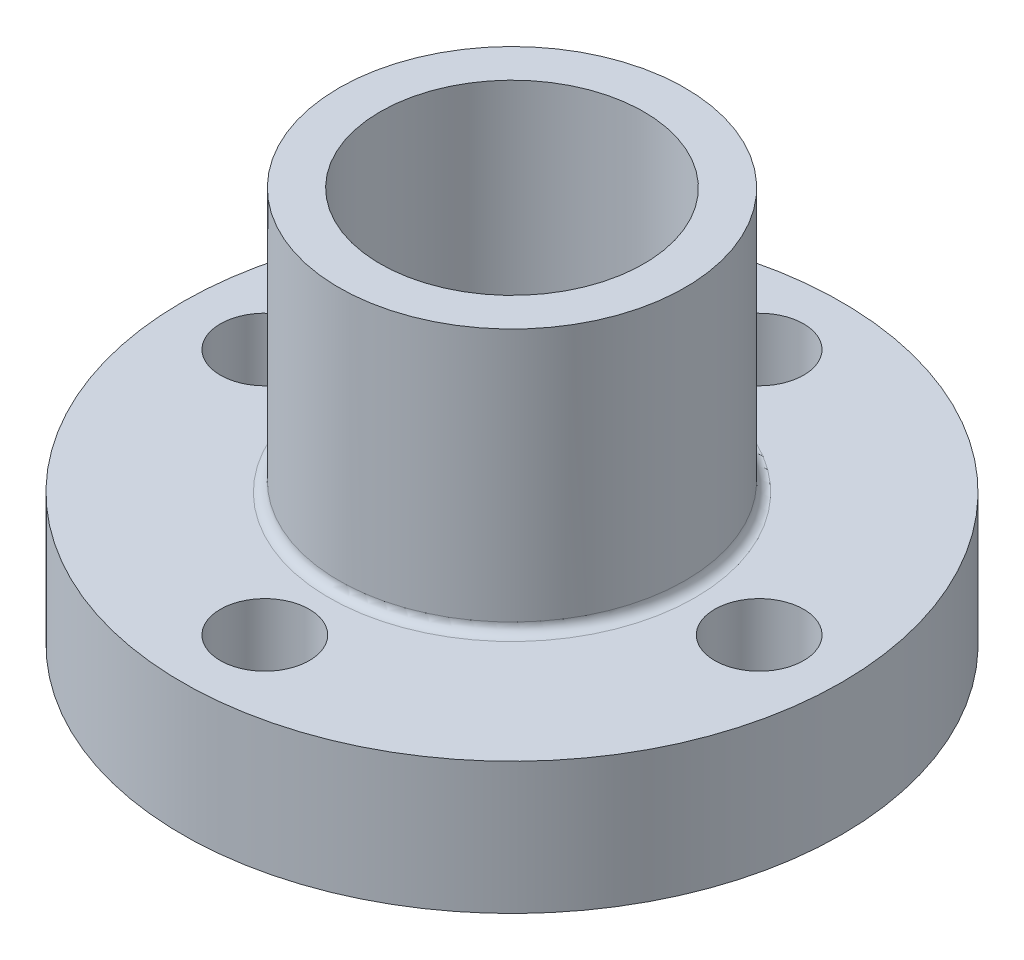
ISO-10303-21;
HEADER;
FILE_DESCRIPTION(('STEP AP214'),'2;1');
FILE_NAME('part.step','',(''),(''),'','','');
FILE_SCHEMA(('AUTOMOTIVE_DESIGN { 1 0 10303 214 1 1 1 1 }'));
ENDSEC;
DATA;
#1=APPLICATION_CONTEXT('core data for automotive mechanical design processes');
#2=APPLICATION_PROTOCOL_DEFINITION('international standard','automotive_design',2000,#1);
#3=PRODUCT_CONTEXT('',#1,'mechanical');
#4=PRODUCT('Part','Part','',(#3));
#5=PRODUCT_RELATED_PRODUCT_CATEGORY('part','',(#4));
#6=PRODUCT_DEFINITION_FORMATION('','',#4);
#7=PRODUCT_DEFINITION_CONTEXT('part definition',#1,'design');
#8=PRODUCT_DEFINITION('design','',#6,#7);
#9=PRODUCT_DEFINITION_SHAPE('','',#8);
#10=(LENGTH_UNIT() NAMED_UNIT(*) SI_UNIT(.MILLI.,.METRE.));
#11=(NAMED_UNIT(*) PLANE_ANGLE_UNIT() SI_UNIT($,.RADIAN.));
#12=(NAMED_UNIT(*) SI_UNIT($,.STERADIAN.) SOLID_ANGLE_UNIT());
#13=UNCERTAINTY_MEASURE_WITH_UNIT(LENGTH_MEASURE(1.E-05),#10,'distance_accuracy_value','');
#14=(GEOMETRIC_REPRESENTATION_CONTEXT(3) GLOBAL_UNCERTAINTY_ASSIGNED_CONTEXT((#13)) GLOBAL_UNIT_ASSIGNED_CONTEXT((#10,
#11,#12)) REPRESENTATION_CONTEXT('',''));
#15=CARTESIAN_POINT('',(0.,0.,0.));
#16=DIRECTION('',(0.,0.,1.));
#17=DIRECTION('',(1.,0.,0.));
#18=AXIS2_PLACEMENT_3D('',#15,#16,#17);
#19=CARTESIAN_POINT('',(0.,12.,0.));
#20=DIRECTION('',(0.,-1.,0.));
#21=DIRECTION('',(1.,0.,0.));
#22=AXIS2_PLACEMENT_3D('',#19,#20,#21);
#23=PLANE('',#22);
#24=CARTESIAN_POINT('',(0.,12.,0.));
#25=DIRECTION('',(0.,1.,0.));
#26=DIRECTION('',(-1.,0.,0.));
#27=AXIS2_PLACEMENT_3D('',#24,#25,#26);
#28=CIRCLE('',#27,4.);
#29=CARTESIAN_POINT('',(-4.,12.,0.));
#30=VERTEX_POINT('',#29);
#31=EDGE_CURVE('E47',#30,#30,#28,.T.);
#32=ORIENTED_EDGE('',*,*,#31,.F.);
#33=EDGE_LOOP('',(#32));
#34=FACE_BOUND('',#33,.T.);
#35=CARTESIAN_POINT('',(0.,12.,0.));
#36=DIRECTION('',(0.,1.,0.));
#37=DIRECTION('',(-1.,0.,0.));
#38=AXIS2_PLACEMENT_3D('',#35,#36,#37);
#39=CIRCLE('',#38,5.25);
#40=CARTESIAN_POINT('',(-5.25,12.,0.));
#41=VERTEX_POINT('',#40);
#42=EDGE_CURVE('E62',#41,#41,#39,.T.);
#43=ORIENTED_EDGE('',*,*,#42,.T.);
#44=EDGE_LOOP('',(#43));
#45=FACE_BOUND('',#44,.T.);
#46=ADVANCED_FACE('F36',(#34,#45),#23,.F.);
#47=CARTESIAN_POINT('',(0.,12.,0.));
#48=DIRECTION('',(0.,1.,0.));
#49=DIRECTION('',(-1.,0.,0.));
#50=AXIS2_PLACEMENT_3D('',#47,#48,#49);
#51=CYLINDRICAL_SURFACE('',#50,4.);
#52=CARTESIAN_POINT('',(0.,0.,0.));
#53=DIRECTION('',(0.,1.,0.));
#54=DIRECTION('',(-1.,0.,0.));
#55=AXIS2_PLACEMENT_3D('',#52,#53,#54);
#56=CIRCLE('',#55,4.);
#57=CARTESIAN_POINT('',(-4.,0.,0.));
#58=VERTEX_POINT('',#57);
#59=EDGE_CURVE('E51',#58,#58,#56,.T.);
#60=ORIENTED_EDGE('',*,*,#59,.F.);
#61=EDGE_LOOP('',(#60));
#62=FACE_BOUND('',#61,.T.);
#63=ORIENTED_EDGE('',*,*,#31,.T.);
#64=EDGE_LOOP('',(#63));
#65=FACE_BOUND('',#64,.T.);
#66=ADVANCED_FACE('F115',(#62,#65),#51,.F.);
#67=CARTESIAN_POINT('',(0.,0.,0.));
#68=DIRECTION('',(0.,1.,0.));
#69=DIRECTION('',(-1.,0.,0.));
#70=AXIS2_PLACEMENT_3D('',#67,#68,#69);
#71=PLANE('',#70);
#72=CARTESIAN_POINT('',(0.,0.,7.5));
#73=DIRECTION('',(0.,1.,0.));
#74=DIRECTION('',(-1.,0.,0.));
#75=AXIS2_PLACEMENT_3D('',#72,#73,#74);
#76=CIRCLE('',#75,1.35);
#77=CARTESIAN_POINT('',(-1.35000000000003,0.,7.5));
#78=VERTEX_POINT('',#77);
#79=EDGE_CURVE('E71',#78,#78,#76,.T.);
#80=ORIENTED_EDGE('',*,*,#79,.T.);
#81=EDGE_LOOP('',(#80));
#82=FACE_BOUND('',#81,.T.);
#83=CARTESIAN_POINT('',(-7.50000000000001,0.,0.));
#84=DIRECTION('',(0.,1.,0.));
#85=DIRECTION('',(-1.,0.,0.));
#86=AXIS2_PLACEMENT_3D('',#83,#84,#85);
#87=CIRCLE('',#86,1.35);
#88=CARTESIAN_POINT('',(-8.85,0.,0.));
#89=VERTEX_POINT('',#88);
#90=EDGE_CURVE('E74',#89,#89,#87,.T.);
#91=ORIENTED_EDGE('',*,*,#90,.T.);
#92=EDGE_LOOP('',(#91));
#93=FACE_BOUND('',#92,.T.);
#94=CARTESIAN_POINT('',(0.,0.,-7.5));
#95=DIRECTION('',(0.,1.,0.));
#96=DIRECTION('',(-1.,0.,0.));
#97=AXIS2_PLACEMENT_3D('',#94,#95,#96);
#98=CIRCLE('',#97,1.35);
#99=CARTESIAN_POINT('',(-1.34999999999993,0.,-7.5));
#100=VERTEX_POINT('',#99);
#101=EDGE_CURVE('E77',#100,#100,#98,.T.);
#102=ORIENTED_EDGE('',*,*,#101,.T.);
#103=EDGE_LOOP('',(#102));
#104=FACE_BOUND('',#103,.T.);
#105=CARTESIAN_POINT('',(7.49999999999999,0.,0.));
#106=DIRECTION('',(0.,1.,0.));
#107=DIRECTION('',(-1.,0.,0.));
#108=AXIS2_PLACEMENT_3D('',#105,#106,#107);
#109=CIRCLE('',#108,1.35);
#110=CARTESIAN_POINT('',(6.14999999999999,0.,0.));
#111=VERTEX_POINT('',#110);
#112=EDGE_CURVE('E65',#111,#111,#109,.T.);
#113=ORIENTED_EDGE('',*,*,#112,.T.);
#114=EDGE_LOOP('',(#113));
#115=FACE_BOUND('',#114,.T.);
#116=CARTESIAN_POINT('',(0.,0.,0.));
#117=DIRECTION('',(0.,1.,0.));
#118=DIRECTION('',(-1.,0.,0.));
#119=AXIS2_PLACEMENT_3D('',#116,#117,#118);
#120=CIRCLE('',#119,10.);
#121=CARTESIAN_POINT('',(-10.,0.,0.));
#122=VERTEX_POINT('',#121);
#123=EDGE_CURVE('E56',#122,#122,#120,.T.);
#124=ORIENTED_EDGE('',*,*,#123,.F.);
#125=EDGE_LOOP('',(#124));
#126=FACE_BOUND('',#125,.T.);
#127=ORIENTED_EDGE('',*,*,#59,.T.);
#128=EDGE_LOOP('',(#127));
#129=FACE_BOUND('',#128,.T.);
#130=ADVANCED_FACE('F109',(#82,#93,#104,#115,#126,#129),#71,.F.);
#131=CARTESIAN_POINT('',(0.,12.,0.));
#132=DIRECTION('',(0.,1.,0.));
#133=DIRECTION('',(-1.,0.,0.));
#134=AXIS2_PLACEMENT_3D('',#131,#132,#133);
#135=CYLINDRICAL_SURFACE('',#134,10.);
#136=CARTESIAN_POINT('',(0.,4.,0.));
#137=DIRECTION('',(0.,1.,0.));
#138=DIRECTION('',(-1.,0.,0.));
#139=AXIS2_PLACEMENT_3D('',#136,#137,#138);
#140=CIRCLE('',#139,10.);
#141=CARTESIAN_POINT('',(-10.,4.,0.));
#142=VERTEX_POINT('',#141);
#143=EDGE_CURVE('E59',#142,#142,#140,.T.);
#144=ORIENTED_EDGE('',*,*,#143,.F.);
#145=EDGE_LOOP('',(#144));
#146=FACE_BOUND('',#145,.T.);
#147=ORIENTED_EDGE('',*,*,#123,.T.);
#148=EDGE_LOOP('',(#147));
#149=FACE_BOUND('',#148,.T.);
#150=ADVANCED_FACE('F97',(#146,#149),#135,.T.);
#151=CARTESIAN_POINT('',(0.,4.,0.));
#152=DIRECTION('',(0.,-1.,0.));
#153=DIRECTION('',(1.,0.,0.));
#154=AXIS2_PLACEMENT_3D('',#151,#152,#153);
#155=PLANE('',#154);
#156=CARTESIAN_POINT('',(0.,4.,0.));
#157=DIRECTION('',(0.,-1.,0.));
#158=DIRECTION('',(1.,0.,0.));
#159=AXIS2_PLACEMENT_3D('',#156,#157,#158);
#160=CIRCLE('',#159,5.55);
#161=CARTESIAN_POINT('',(5.55,4.,0.));
#162=VERTEX_POINT('',#161);
#163=EDGE_CURVE('E10',#162,#162,#160,.T.);
#164=ORIENTED_EDGE('',*,*,#163,.T.);
#165=EDGE_LOOP('',(#164));
#166=FACE_BOUND('',#165,.T.);
#167=CARTESIAN_POINT('',(0.,4.,7.5));
#168=DIRECTION('',(0.,1.,0.));
#169=DIRECTION('',(-1.,0.,0.));
#170=AXIS2_PLACEMENT_3D('',#167,#168,#169);
#171=CIRCLE('',#170,1.35);
#172=CARTESIAN_POINT('',(-1.35000000000003,4.,7.5));
#173=VERTEX_POINT('',#172);
#174=EDGE_CURVE('E80',#173,#173,#171,.T.);
#175=ORIENTED_EDGE('',*,*,#174,.F.);
#176=EDGE_LOOP('',(#175));
#177=FACE_BOUND('',#176,.T.);
#178=CARTESIAN_POINT('',(-7.5,4.00000000000001,0.));
#179=DIRECTION('',(0.,1.,0.));
#180=DIRECTION('',(-1.,0.,0.));
#181=AXIS2_PLACEMENT_3D('',#178,#179,#180);
#182=CIRCLE('',#181,1.35);
#183=CARTESIAN_POINT('',(-8.85,4.00000000000001,0.));
#184=VERTEX_POINT('',#183);
#185=EDGE_CURVE('E84',#184,#184,#182,.T.);
#186=ORIENTED_EDGE('',*,*,#185,.F.);
#187=EDGE_LOOP('',(#186));
#188=FACE_BOUND('',#187,.T.);
#189=CARTESIAN_POINT('',(0.,4.,-7.5));
#190=DIRECTION('',(0.,1.,0.));
#191=DIRECTION('',(-1.,0.,0.));
#192=AXIS2_PLACEMENT_3D('',#189,#190,#191);
#193=CIRCLE('',#192,1.35);
#194=CARTESIAN_POINT('',(-1.34999999999992,4.,-7.5));
#195=VERTEX_POINT('',#194);
#196=EDGE_CURVE('E81',#195,#195,#193,.T.);
#197=ORIENTED_EDGE('',*,*,#196,.F.);
#198=EDGE_LOOP('',(#197));
#199=FACE_BOUND('',#198,.T.);
#200=CARTESIAN_POINT('',(7.5,3.99999999999999,0.));
#201=DIRECTION('',(0.,1.,0.));
#202=DIRECTION('',(-1.,0.,0.));
#203=AXIS2_PLACEMENT_3D('',#200,#201,#202);
#204=CIRCLE('',#203,1.35);
#205=CARTESIAN_POINT('',(6.15,3.99999999999999,0.));
#206=VERTEX_POINT('',#205);
#207=EDGE_CURVE('E68',#206,#206,#204,.T.);
#208=ORIENTED_EDGE('',*,*,#207,.F.);
#209=EDGE_LOOP('',(#208));
#210=FACE_BOUND('',#209,.T.);
#211=ORIENTED_EDGE('',*,*,#143,.T.);
#212=EDGE_LOOP('',(#211));
#213=FACE_BOUND('',#212,.T.);
#214=ADVANCED_FACE('F93',(#166,#177,#188,#199,#210,#213),#155,.F.);
#215=CARTESIAN_POINT('',(0.,12.,0.));
#216=DIRECTION('',(0.,1.,0.));
#217=DIRECTION('',(-1.,0.,0.));
#218=AXIS2_PLACEMENT_3D('',#215,#216,#217);
#219=CYLINDRICAL_SURFACE('',#218,5.25);
#220=CARTESIAN_POINT('',(0.,4.3,0.));
#221=DIRECTION('',(0.,-1.,0.));
#222=DIRECTION('',(1.,0.,0.));
#223=AXIS2_PLACEMENT_3D('',#220,#221,#222);
#224=CIRCLE('',#223,5.25);
#225=CARTESIAN_POINT('',(5.25,4.3,0.));
#226=VERTEX_POINT('',#225);
#227=EDGE_CURVE('E43',#226,#226,#224,.F.);
#228=ORIENTED_EDGE('',*,*,#227,.T.);
#229=EDGE_LOOP('',(#228));
#230=FACE_BOUND('',#229,.T.);
#231=ORIENTED_EDGE('',*,*,#42,.F.);
#232=EDGE_LOOP('',(#231));
#233=FACE_BOUND('',#232,.T.);
#234=ADVANCED_FACE('F96',(#230,#233),#219,.T.);
#235=CARTESIAN_POINT('',(7.49999999999999,-6.00000000000001,0.));
#236=DIRECTION('',(0.,1.,0.));
#237=DIRECTION('',(-1.,0.,0.));
#238=AXIS2_PLACEMENT_3D('',#235,#236,#237);
#239=CYLINDRICAL_SURFACE('',#238,1.35);
#240=ORIENTED_EDGE('',*,*,#207,.T.);
#241=EDGE_LOOP('',(#240));
#242=FACE_BOUND('',#241,.T.);
#243=ORIENTED_EDGE('',*,*,#112,.F.);
#244=EDGE_LOOP('',(#243));
#245=FACE_BOUND('',#244,.T.);
#246=ADVANCED_FACE('F130',(#242,#245),#239,.F.);
#247=CARTESIAN_POINT('',(0.,-6.,-7.5));
#248=DIRECTION('',(0.,1.,0.));
#249=DIRECTION('',(-1.,0.,0.));
#250=AXIS2_PLACEMENT_3D('',#247,#248,#249);
#251=CYLINDRICAL_SURFACE('',#250,1.35);
#252=ORIENTED_EDGE('',*,*,#196,.T.);
#253=EDGE_LOOP('',(#252));
#254=FACE_BOUND('',#253,.T.);
#255=ORIENTED_EDGE('',*,*,#101,.F.);
#256=EDGE_LOOP('',(#255));
#257=FACE_BOUND('',#256,.T.);
#258=ADVANCED_FACE('F135',(#254,#257),#251,.F.);
#259=CARTESIAN_POINT('',(-7.50000000000001,-5.99999999999999,0.));
#260=DIRECTION('',(0.,1.,0.));
#261=DIRECTION('',(-1.,0.,0.));
#262=AXIS2_PLACEMENT_3D('',#259,#260,#261);
#263=CYLINDRICAL_SURFACE('',#262,1.35);
#264=ORIENTED_EDGE('',*,*,#185,.T.);
#265=EDGE_LOOP('',(#264));
#266=FACE_BOUND('',#265,.T.);
#267=ORIENTED_EDGE('',*,*,#90,.F.);
#268=EDGE_LOOP('',(#267));
#269=FACE_BOUND('',#268,.T.);
#270=ADVANCED_FACE('F141',(#266,#269),#263,.F.);
#271=CARTESIAN_POINT('',(0.,-6.,7.5));
#272=DIRECTION('',(0.,1.,0.));
#273=DIRECTION('',(-1.,0.,0.));
#274=AXIS2_PLACEMENT_3D('',#271,#272,#273);
#275=CYLINDRICAL_SURFACE('',#274,1.35);
#276=ORIENTED_EDGE('',*,*,#174,.T.);
#277=EDGE_LOOP('',(#276));
#278=FACE_BOUND('',#277,.T.);
#279=ORIENTED_EDGE('',*,*,#79,.F.);
#280=EDGE_LOOP('',(#279));
#281=FACE_BOUND('',#280,.T.);
#282=ADVANCED_FACE('F90',(#278,#281),#275,.F.);
#283=CARTESIAN_POINT('',(0.,4.3,0.));
#284=DIRECTION('',(0.,-1.,0.));
#285=DIRECTION('',(1.,0.,0.));
#286=AXIS2_PLACEMENT_3D('',#283,#284,#285);
#287=TOROIDAL_SURFACE('',#286,5.55,0.3);
#288=ORIENTED_EDGE('',*,*,#163,.F.);
#289=EDGE_LOOP('',(#288));
#290=FACE_BOUND('',#289,.T.);
#291=ORIENTED_EDGE('',*,*,#227,.F.);
#292=EDGE_LOOP('',(#291));
#293=FACE_BOUND('',#292,.T.);
#294=ADVANCED_FACE('F38',(#290,#293),#287,.F.);
#295=CLOSED_SHELL('',(#46,#66,#130,#150,#214,#234,#246,#258,#270,#282,#294));
#296=MANIFOLD_SOLID_BREP('B2',#295);
#297=ADVANCED_BREP_SHAPE_REPRESENTATION('',(#18,#296),#14);
#298=SHAPE_DEFINITION_REPRESENTATION(#9,#297);
ENDSEC;
END-ISO-10303-21;
